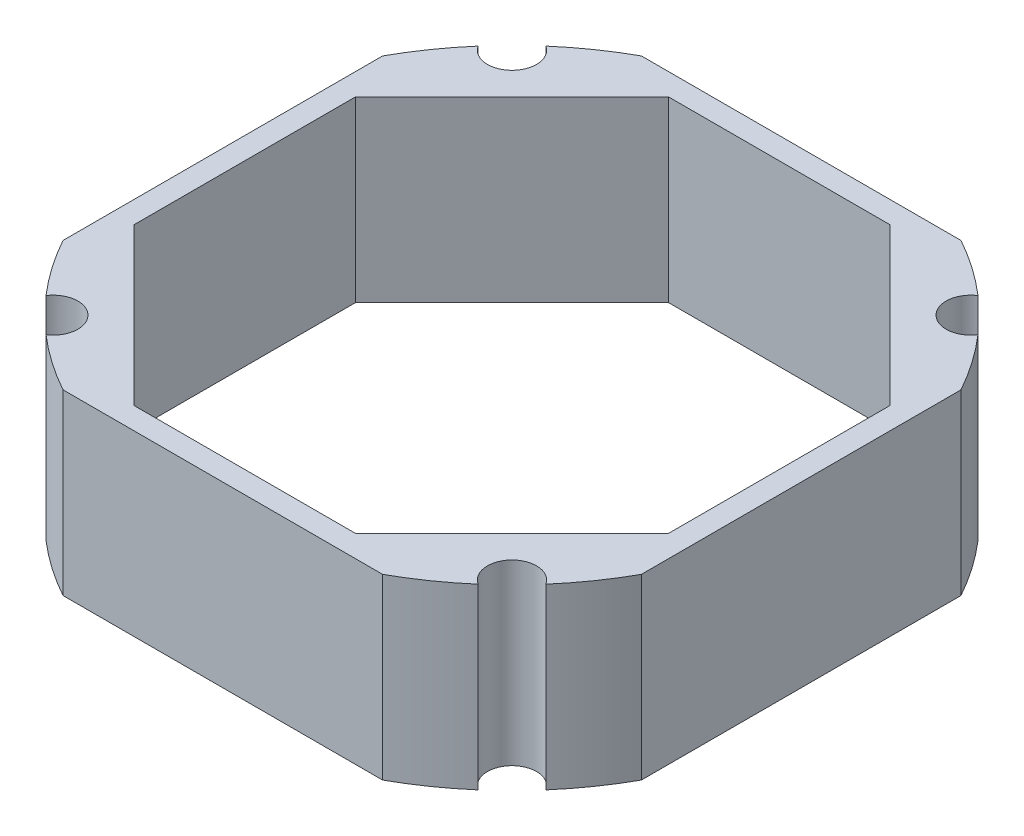
ISO-10303-21;
HEADER;
FILE_DESCRIPTION(('STEP AP214'),'2;1');
FILE_NAME('part.step','',(''),(''),'','','');
FILE_SCHEMA(('AUTOMOTIVE_DESIGN { 1 0 10303 214 1 1 1 1 }'));
ENDSEC;
DATA;
#1=APPLICATION_CONTEXT('core data for automotive mechanical design processes');
#2=APPLICATION_PROTOCOL_DEFINITION('international standard','automotive_design',2000,#1);
#3=PRODUCT_CONTEXT('',#1,'mechanical');
#4=PRODUCT('Part','Part','',(#3));
#5=PRODUCT_RELATED_PRODUCT_CATEGORY('part','',(#4));
#6=PRODUCT_DEFINITION_FORMATION('','',#4);
#7=PRODUCT_DEFINITION_CONTEXT('part definition',#1,'design');
#8=PRODUCT_DEFINITION('design','',#6,#7);
#9=PRODUCT_DEFINITION_SHAPE('','',#8);
#10=(LENGTH_UNIT() NAMED_UNIT(*) SI_UNIT(.MILLI.,.METRE.));
#11=(NAMED_UNIT(*) PLANE_ANGLE_UNIT() SI_UNIT($,.RADIAN.));
#12=(NAMED_UNIT(*) SI_UNIT($,.STERADIAN.) SOLID_ANGLE_UNIT());
#13=UNCERTAINTY_MEASURE_WITH_UNIT(LENGTH_MEASURE(1.E-05),#10,'distance_accuracy_value','');
#14=(GEOMETRIC_REPRESENTATION_CONTEXT(3) GLOBAL_UNCERTAINTY_ASSIGNED_CONTEXT((#13)) GLOBAL_UNIT_ASSIGNED_CONTEXT((#10,
#11,#12)) REPRESENTATION_CONTEXT('',''));
#15=CARTESIAN_POINT('',(0.,0.,0.));
#16=DIRECTION('',(0.,0.,1.));
#17=DIRECTION('',(1.,0.,0.));
#18=AXIS2_PLACEMENT_3D('',#15,#16,#17);
#19=CARTESIAN_POINT('',(-15.4449798680672,12.,15.4449798680672));
#20=DIRECTION('',(0.,-1.,0.));
#21=DIRECTION('',(0.,0.,-1.));
#22=AXIS2_PLACEMENT_3D('',#19,#20,#21);
#23=CYLINDRICAL_SURFACE('',#22,1.65000000000001);
#24=CARTESIAN_POINT('',(-15.4449798680672,0.,15.4449798680672));
#25=DIRECTION('',(0.,1.,0.));
#26=DIRECTION('',(0.,0.,1.));
#27=AXIS2_PLACEMENT_3D('',#24,#25,#26);
#28=CIRCLE('',#27,1.65000000000001);
#29=CARTESIAN_POINT('',(-14.5514142996868,0.,16.8320777647583));
#30=VERTEX_POINT('',#29);
#31=CARTESIAN_POINT('',(-16.8320777647583,0.,14.5514142996868));
#32=VERTEX_POINT('',#31);
#33=EDGE_CURVE('E274',#30,#32,#28,.T.);
#34=ORIENTED_EDGE('',*,*,#33,.F.);
#35=DIRECTION('',(0.,-1.,0.));
#36=VECTOR('',#35,1.);
#37=CARTESIAN_POINT('',(-14.5514142996868,12.,16.8320777647583));
#38=LINE('',#37,#36);
#39=CARTESIAN_POINT('',(-14.5514142996868,12.,16.8320777647583));
#40=VERTEX_POINT('',#39);
#41=EDGE_CURVE('E11',#40,#30,#38,.T.);
#42=ORIENTED_EDGE('',*,*,#41,.F.);
#43=CARTESIAN_POINT('',(-15.4449798680672,12.,15.4449798680672));
#44=DIRECTION('',(0.,1.,0.));
#45=DIRECTION('',(0.,0.,1.));
#46=AXIS2_PLACEMENT_3D('',#43,#44,#45);
#47=CIRCLE('',#46,1.65000000000001);
#48=CARTESIAN_POINT('',(-16.8320777647583,12.,14.5514142996868));
#49=VERTEX_POINT('',#48);
#50=EDGE_CURVE('E442',#40,#49,#47,.T.);
#51=ORIENTED_EDGE('',*,*,#50,.T.);
#52=DIRECTION('',(0.,-1.,0.));
#53=VECTOR('',#52,1.);
#54=CARTESIAN_POINT('',(-16.8320777647583,12.,14.5514142996868));
#55=LINE('',#54,#53);
#56=EDGE_CURVE('E143',#49,#32,#55,.T.);
#57=ORIENTED_EDGE('',*,*,#56,.T.);
#58=EDGE_LOOP('',(#34,#42,#51,#57));
#59=FACE_BOUND('',#58,.T.);
#60=ADVANCED_FACE('F41',(#59),#23,.F.);
#61=CARTESIAN_POINT('',(0.,12.,0.));
#62=DIRECTION('',(0.,-1.,0.));
#63=DIRECTION('',(0.,0.,-1.));
#64=AXIS2_PLACEMENT_3D('',#61,#62,#63);
#65=CYLINDRICAL_SURFACE('',#64,22.25);
#66=CARTESIAN_POINT('',(0.,0.,0.));
#67=DIRECTION('',(0.,1.,0.));
#68=DIRECTION('',(0.,0.,1.));
#69=AXIS2_PLACEMENT_3D('',#66,#67,#68);
#70=CIRCLE('',#69,22.25);
#71=CARTESIAN_POINT('',(-10.7604309857923,0.,19.475));
#72=VERTEX_POINT('',#71);
#73=EDGE_CURVE('E278',#30,#72,#70,.T.);
#74=ORIENTED_EDGE('',*,*,#73,.T.);
#75=DIRECTION('',(0.,-1.,0.));
#76=VECTOR('',#75,1.);
#77=CARTESIAN_POINT('',(-10.7604309857923,12.,19.475));
#78=LINE('',#77,#76);
#79=CARTESIAN_POINT('',(-10.7604309857923,12.,19.475));
#80=VERTEX_POINT('',#79);
#81=EDGE_CURVE('E52',#80,#72,#78,.T.);
#82=ORIENTED_EDGE('',*,*,#81,.F.);
#83=CARTESIAN_POINT('',(0.,12.,0.));
#84=DIRECTION('',(0.,1.,0.));
#85=DIRECTION('',(0.,0.,1.));
#86=AXIS2_PLACEMENT_3D('',#83,#84,#85);
#87=CIRCLE('',#86,22.25);
#88=EDGE_CURVE('E445',#40,#80,#87,.T.);
#89=ORIENTED_EDGE('',*,*,#88,.F.);
#90=ORIENTED_EDGE('',*,*,#41,.T.);
#91=EDGE_LOOP('',(#74,#82,#89,#90));
#92=FACE_BOUND('',#91,.T.);
#93=ADVANCED_FACE('F495',(#92),#65,.T.);
#94=CARTESIAN_POINT('',(0.,12.,19.475));
#95=DIRECTION('',(0.,0.,1.));
#96=DIRECTION('',(1.,0.,0.));
#97=AXIS2_PLACEMENT_3D('',#94,#95,#96);
#98=PLANE('',#97);
#99=DIRECTION('',(-1.,0.,0.));
#100=VECTOR('',#99,1.);
#101=CARTESIAN_POINT('',(0.,0.,19.475));
#102=LINE('',#101,#100);
#103=CARTESIAN_POINT('',(10.7604309857924,0.,19.475));
#104=VERTEX_POINT('',#103);
#105=EDGE_CURVE('E282',#104,#72,#102,.T.);
#106=ORIENTED_EDGE('',*,*,#105,.F.);
#107=DIRECTION('',(0.,-1.,0.));
#108=VECTOR('',#107,1.);
#109=CARTESIAN_POINT('',(10.7604309857924,12.,19.475));
#110=LINE('',#109,#108);
#111=CARTESIAN_POINT('',(10.7604309857924,12.,19.475));
#112=VERTEX_POINT('',#111);
#113=EDGE_CURVE('E372',#112,#104,#110,.T.);
#114=ORIENTED_EDGE('',*,*,#113,.F.);
#115=DIRECTION('',(-1.,0.,0.));
#116=VECTOR('',#115,1.);
#117=CARTESIAN_POINT('',(0.,12.,19.475));
#118=LINE('',#117,#116);
#119=EDGE_CURVE('E448',#112,#80,#118,.T.);
#120=ORIENTED_EDGE('',*,*,#119,.T.);
#121=ORIENTED_EDGE('',*,*,#81,.T.);
#122=EDGE_LOOP('',(#106,#114,#120,#121));
#123=FACE_BOUND('',#122,.T.);
#124=ADVANCED_FACE('F498',(#123),#98,.T.);
#125=CARTESIAN_POINT('',(0.,12.,0.));
#126=DIRECTION('',(0.,-1.,0.));
#127=DIRECTION('',(0.,0.,-1.));
#128=AXIS2_PLACEMENT_3D('',#125,#126,#127);
#129=CYLINDRICAL_SURFACE('',#128,22.25);
#130=CARTESIAN_POINT('',(0.,0.,0.));
#131=DIRECTION('',(0.,1.,0.));
#132=DIRECTION('',(0.,0.,1.));
#133=AXIS2_PLACEMENT_3D('',#130,#131,#132);
#134=CIRCLE('',#133,22.25);
#135=CARTESIAN_POINT('',(14.5514142996868,0.,16.8320777647583));
#136=VERTEX_POINT('',#135);
#137=EDGE_CURVE('E286',#104,#136,#134,.T.);
#138=ORIENTED_EDGE('',*,*,#137,.T.);
#139=DIRECTION('',(0.,-1.,0.));
#140=VECTOR('',#139,1.);
#141=CARTESIAN_POINT('',(14.5514142996868,12.,16.8320777647583));
#142=LINE('',#141,#140);
#143=CARTESIAN_POINT('',(14.5514142996868,12.,16.8320777647583));
#144=VERTEX_POINT('',#143);
#145=EDGE_CURVE('E369',#144,#136,#142,.T.);
#146=ORIENTED_EDGE('',*,*,#145,.F.);
#147=CARTESIAN_POINT('',(0.,12.,0.));
#148=DIRECTION('',(0.,1.,0.));
#149=DIRECTION('',(0.,0.,1.));
#150=AXIS2_PLACEMENT_3D('',#147,#148,#149);
#151=CIRCLE('',#150,22.25);
#152=EDGE_CURVE('E452',#112,#144,#151,.T.);
#153=ORIENTED_EDGE('',*,*,#152,.F.);
#154=ORIENTED_EDGE('',*,*,#113,.T.);
#155=EDGE_LOOP('',(#138,#146,#153,#154));
#156=FACE_BOUND('',#155,.T.);
#157=ADVANCED_FACE('F503',(#156),#129,.T.);
#158=CARTESIAN_POINT('',(15.4449798680672,12.,15.4449798680672));
#159=DIRECTION('',(0.,-1.,0.));
#160=DIRECTION('',(0.,0.,-1.));
#161=AXIS2_PLACEMENT_3D('',#158,#159,#160);
#162=CYLINDRICAL_SURFACE('',#161,1.65);
#163=CARTESIAN_POINT('',(15.4449798680672,0.,15.4449798680672));
#164=DIRECTION('',(0.,1.,0.));
#165=DIRECTION('',(0.,0.,1.));
#166=AXIS2_PLACEMENT_3D('',#163,#164,#165);
#167=CIRCLE('',#166,1.65);
#168=CARTESIAN_POINT('',(16.8320777647583,0.,14.5514142996868));
#169=VERTEX_POINT('',#168);
#170=EDGE_CURVE('E290',#169,#136,#167,.T.);
#171=ORIENTED_EDGE('',*,*,#170,.F.);
#172=DIRECTION('',(0.,-1.,0.));
#173=VECTOR('',#172,1.);
#174=CARTESIAN_POINT('',(16.8320777647583,12.,14.5514142996868));
#175=LINE('',#174,#173);
#176=CARTESIAN_POINT('',(16.8320777647583,12.,14.5514142996868));
#177=VERTEX_POINT('',#176);
#178=EDGE_CURVE('E366',#177,#169,#175,.T.);
#179=ORIENTED_EDGE('',*,*,#178,.F.);
#180=CARTESIAN_POINT('',(15.4449798680672,12.,15.4449798680672));
#181=DIRECTION('',(0.,1.,0.));
#182=DIRECTION('',(0.,0.,1.));
#183=AXIS2_PLACEMENT_3D('',#180,#181,#182);
#184=CIRCLE('',#183,1.65);
#185=EDGE_CURVE('E455',#177,#144,#184,.T.);
#186=ORIENTED_EDGE('',*,*,#185,.T.);
#187=ORIENTED_EDGE('',*,*,#145,.T.);
#188=EDGE_LOOP('',(#171,#179,#186,#187));
#189=FACE_BOUND('',#188,.T.);
#190=ADVANCED_FACE('F509',(#189),#162,.F.);
#191=CARTESIAN_POINT('',(0.,12.,0.));
#192=DIRECTION('',(0.,-1.,0.));
#193=DIRECTION('',(0.,0.,-1.));
#194=AXIS2_PLACEMENT_3D('',#191,#192,#193);
#195=CYLINDRICAL_SURFACE('',#194,22.25);
#196=CARTESIAN_POINT('',(0.,0.,0.));
#197=DIRECTION('',(0.,1.,0.));
#198=DIRECTION('',(0.,0.,1.));
#199=AXIS2_PLACEMENT_3D('',#196,#197,#198);
#200=CIRCLE('',#199,22.25);
#201=CARTESIAN_POINT('',(19.475,0.,10.7604309857923));
#202=VERTEX_POINT('',#201);
#203=EDGE_CURVE('E294',#169,#202,#200,.T.);
#204=ORIENTED_EDGE('',*,*,#203,.T.);
#205=DIRECTION('',(0.,-1.,0.));
#206=VECTOR('',#205,1.);
#207=CARTESIAN_POINT('',(19.475,12.,10.7604309857923));
#208=LINE('',#207,#206);
#209=CARTESIAN_POINT('',(19.475,12.,10.7604309857923));
#210=VERTEX_POINT('',#209);
#211=EDGE_CURVE('E362',#210,#202,#208,.T.);
#212=ORIENTED_EDGE('',*,*,#211,.F.);
#213=CARTESIAN_POINT('',(0.,12.,0.));
#214=DIRECTION('',(0.,1.,0.));
#215=DIRECTION('',(0.,0.,1.));
#216=AXIS2_PLACEMENT_3D('',#213,#214,#215);
#217=CIRCLE('',#216,22.25);
#218=EDGE_CURVE('E459',#177,#210,#217,.T.);
#219=ORIENTED_EDGE('',*,*,#218,.F.);
#220=ORIENTED_EDGE('',*,*,#178,.T.);
#221=EDGE_LOOP('',(#204,#212,#219,#220));
#222=FACE_BOUND('',#221,.T.);
#223=ADVANCED_FACE('F512',(#222),#195,.T.);
#224=CARTESIAN_POINT('',(19.475,12.,0.));
#225=DIRECTION('',(-1.,0.,0.));
#226=DIRECTION('',(0.,0.,1.));
#227=AXIS2_PLACEMENT_3D('',#224,#225,#226);
#228=PLANE('',#227);
#229=DIRECTION('',(0.,0.,-1.));
#230=VECTOR('',#229,1.);
#231=CARTESIAN_POINT('',(19.475,0.,0.));
#232=LINE('',#231,#230);
#233=CARTESIAN_POINT('',(19.475,0.,-10.7604309857923));
#234=VERTEX_POINT('',#233);
#235=EDGE_CURVE('E298',#202,#234,#232,.T.);
#236=ORIENTED_EDGE('',*,*,#235,.T.);
#237=DIRECTION('',(0.,-1.,0.));
#238=VECTOR('',#237,1.);
#239=CARTESIAN_POINT('',(19.475,12.,-10.7604309857923));
#240=LINE('',#239,#238);
#241=CARTESIAN_POINT('',(19.475,12.,-10.7604309857923));
#242=VERTEX_POINT('',#241);
#243=EDGE_CURVE('E358',#242,#234,#240,.T.);
#244=ORIENTED_EDGE('',*,*,#243,.F.);
#245=DIRECTION('',(0.,0.,-1.));
#246=VECTOR('',#245,1.);
#247=CARTESIAN_POINT('',(19.475,12.,0.));
#248=LINE('',#247,#246);
#249=EDGE_CURVE('E463',#210,#242,#248,.T.);
#250=ORIENTED_EDGE('',*,*,#249,.F.);
#251=ORIENTED_EDGE('',*,*,#211,.T.);
#252=EDGE_LOOP('',(#236,#244,#250,#251));
#253=FACE_BOUND('',#252,.T.);
#254=ADVANCED_FACE('F514',(#253),#228,.F.);
#255=CARTESIAN_POINT('',(0.,12.,0.));
#256=DIRECTION('',(0.,-1.,0.));
#257=DIRECTION('',(0.,0.,-1.));
#258=AXIS2_PLACEMENT_3D('',#255,#256,#257);
#259=CYLINDRICAL_SURFACE('',#258,22.25);
#260=CARTESIAN_POINT('',(0.,0.,0.));
#261=DIRECTION('',(0.,1.,0.));
#262=DIRECTION('',(0.,0.,1.));
#263=AXIS2_PLACEMENT_3D('',#260,#261,#262);
#264=CIRCLE('',#263,22.25);
#265=CARTESIAN_POINT('',(16.8320777647583,0.,-14.5514142996868));
#266=VERTEX_POINT('',#265);
#267=EDGE_CURVE('E302',#234,#266,#264,.T.);
#268=ORIENTED_EDGE('',*,*,#267,.T.);
#269=DIRECTION('',(0.,-1.,0.));
#270=VECTOR('',#269,1.);
#271=CARTESIAN_POINT('',(16.8320777647583,12.,-14.5514142996868));
#272=LINE('',#271,#270);
#273=CARTESIAN_POINT('',(16.8320777647583,12.,-14.5514142996868));
#274=VERTEX_POINT('',#273);
#275=EDGE_CURVE('E355',#274,#266,#272,.T.);
#276=ORIENTED_EDGE('',*,*,#275,.F.);
#277=CARTESIAN_POINT('',(0.,12.,0.));
#278=DIRECTION('',(0.,1.,0.));
#279=DIRECTION('',(0.,0.,1.));
#280=AXIS2_PLACEMENT_3D('',#277,#278,#279);
#281=CIRCLE('',#280,22.25);
#282=EDGE_CURVE('E467',#242,#274,#281,.T.);
#283=ORIENTED_EDGE('',*,*,#282,.F.);
#284=ORIENTED_EDGE('',*,*,#243,.T.);
#285=EDGE_LOOP('',(#268,#276,#283,#284));
#286=FACE_BOUND('',#285,.T.);
#287=ADVANCED_FACE('F519',(#286),#259,.T.);
#288=CARTESIAN_POINT('',(15.4449798680672,12.,-15.4449798680672));
#289=DIRECTION('',(0.,-1.,0.));
#290=DIRECTION('',(0.,0.,-1.));
#291=AXIS2_PLACEMENT_3D('',#288,#289,#290);
#292=CYLINDRICAL_SURFACE('',#291,1.64999999999998);
#293=CARTESIAN_POINT('',(15.4449798680672,0.,-15.4449798680672));
#294=DIRECTION('',(0.,1.,0.));
#295=DIRECTION('',(0.,0.,1.));
#296=AXIS2_PLACEMENT_3D('',#293,#294,#295);
#297=CIRCLE('',#296,1.64999999999998);
#298=CARTESIAN_POINT('',(14.5514142996868,0.,-16.8320777647583));
#299=VERTEX_POINT('',#298);
#300=EDGE_CURVE('E306',#299,#266,#297,.T.);
#301=ORIENTED_EDGE('',*,*,#300,.F.);
#302=DIRECTION('',(0.,-1.,0.));
#303=VECTOR('',#302,1.);
#304=CARTESIAN_POINT('',(14.5514142996868,12.,-16.8320777647583));
#305=LINE('',#304,#303);
#306=CARTESIAN_POINT('',(14.5514142996868,12.,-16.8320777647583));
#307=VERTEX_POINT('',#306);
#308=EDGE_CURVE('E352',#307,#299,#305,.T.);
#309=ORIENTED_EDGE('',*,*,#308,.F.);
#310=CARTESIAN_POINT('',(15.4449798680672,12.,-15.4449798680672));
#311=DIRECTION('',(0.,1.,0.));
#312=DIRECTION('',(0.,0.,1.));
#313=AXIS2_PLACEMENT_3D('',#310,#311,#312);
#314=CIRCLE('',#313,1.64999999999998);
#315=EDGE_CURVE('E470',#307,#274,#314,.T.);
#316=ORIENTED_EDGE('',*,*,#315,.T.);
#317=ORIENTED_EDGE('',*,*,#275,.T.);
#318=EDGE_LOOP('',(#301,#309,#316,#317));
#319=FACE_BOUND('',#318,.T.);
#320=ADVANCED_FACE('F522',(#319),#292,.F.);
#321=CARTESIAN_POINT('',(0.,12.,0.));
#322=DIRECTION('',(0.,-1.,0.));
#323=DIRECTION('',(0.,0.,-1.));
#324=AXIS2_PLACEMENT_3D('',#321,#322,#323);
#325=CYLINDRICAL_SURFACE('',#324,22.25);
#326=CARTESIAN_POINT('',(0.,0.,0.));
#327=DIRECTION('',(0.,1.,0.));
#328=DIRECTION('',(0.,0.,1.));
#329=AXIS2_PLACEMENT_3D('',#326,#327,#328);
#330=CIRCLE('',#329,22.25);
#331=CARTESIAN_POINT('',(10.7604309857923,0.,-19.475));
#332=VERTEX_POINT('',#331);
#333=EDGE_CURVE('E310',#299,#332,#330,.T.);
#334=ORIENTED_EDGE('',*,*,#333,.T.);
#335=DIRECTION('',(0.,-1.,0.));
#336=VECTOR('',#335,1.);
#337=CARTESIAN_POINT('',(10.7604309857923,12.,-19.475));
#338=LINE('',#337,#336);
#339=CARTESIAN_POINT('',(10.7604309857923,12.,-19.475));
#340=VERTEX_POINT('',#339);
#341=EDGE_CURVE('E348',#340,#332,#338,.T.);
#342=ORIENTED_EDGE('',*,*,#341,.F.);
#343=CARTESIAN_POINT('',(0.,12.,0.));
#344=DIRECTION('',(0.,1.,0.));
#345=DIRECTION('',(0.,0.,1.));
#346=AXIS2_PLACEMENT_3D('',#343,#344,#345);
#347=CIRCLE('',#346,22.25);
#348=EDGE_CURVE('E474',#307,#340,#347,.T.);
#349=ORIENTED_EDGE('',*,*,#348,.F.);
#350=ORIENTED_EDGE('',*,*,#308,.T.);
#351=EDGE_LOOP('',(#334,#342,#349,#350));
#352=FACE_BOUND('',#351,.T.);
#353=ADVANCED_FACE('F527',(#352),#325,.T.);
#354=CARTESIAN_POINT('',(0.,12.,-19.475));
#355=DIRECTION('',(0.,0.,1.));
#356=DIRECTION('',(1.,0.,0.));
#357=AXIS2_PLACEMENT_3D('',#354,#355,#356);
#358=PLANE('',#357);
#359=DIRECTION('',(-1.,0.,0.));
#360=VECTOR('',#359,1.);
#361=CARTESIAN_POINT('',(0.,0.,-19.475));
#362=LINE('',#361,#360);
#363=CARTESIAN_POINT('',(-10.7604309857923,0.,-19.475));
#364=VERTEX_POINT('',#363);
#365=EDGE_CURVE('E314',#332,#364,#362,.T.);
#366=ORIENTED_EDGE('',*,*,#365,.T.);
#367=DIRECTION('',(0.,-1.,0.));
#368=VECTOR('',#367,1.);
#369=CARTESIAN_POINT('',(-10.7604309857923,12.,-19.475));
#370=LINE('',#369,#368);
#371=CARTESIAN_POINT('',(-10.7604309857923,12.,-19.475));
#372=VERTEX_POINT('',#371);
#373=EDGE_CURVE('E344',#372,#364,#370,.T.);
#374=ORIENTED_EDGE('',*,*,#373,.F.);
#375=DIRECTION('',(-1.,0.,0.));
#376=VECTOR('',#375,1.);
#377=CARTESIAN_POINT('',(0.,12.,-19.475));
#378=LINE('',#377,#376);
#379=EDGE_CURVE('E478',#340,#372,#378,.T.);
#380=ORIENTED_EDGE('',*,*,#379,.F.);
#381=ORIENTED_EDGE('',*,*,#341,.T.);
#382=EDGE_LOOP('',(#366,#374,#380,#381));
#383=FACE_BOUND('',#382,.T.);
#384=ADVANCED_FACE('F530',(#383),#358,.F.);
#385=CARTESIAN_POINT('',(0.,12.,0.));
#386=DIRECTION('',(0.,-1.,0.));
#387=DIRECTION('',(0.,0.,-1.));
#388=AXIS2_PLACEMENT_3D('',#385,#386,#387);
#389=CYLINDRICAL_SURFACE('',#388,22.25);
#390=CARTESIAN_POINT('',(0.,0.,0.));
#391=DIRECTION('',(0.,1.,0.));
#392=DIRECTION('',(0.,0.,1.));
#393=AXIS2_PLACEMENT_3D('',#390,#391,#392);
#394=CIRCLE('',#393,22.25);
#395=CARTESIAN_POINT('',(-14.5514142996868,0.,-16.8320777647583));
#396=VERTEX_POINT('',#395);
#397=EDGE_CURVE('E318',#364,#396,#394,.T.);
#398=ORIENTED_EDGE('',*,*,#397,.T.);
#399=DIRECTION('',(0.,-1.,0.));
#400=VECTOR('',#399,1.);
#401=CARTESIAN_POINT('',(-14.5514142996868,12.,-16.8320777647583));
#402=LINE('',#401,#400);
#403=CARTESIAN_POINT('',(-14.5514142996868,12.,-16.8320777647583));
#404=VERTEX_POINT('',#403);
#405=EDGE_CURVE('E341',#404,#396,#402,.T.);
#406=ORIENTED_EDGE('',*,*,#405,.F.);
#407=CARTESIAN_POINT('',(0.,12.,0.));
#408=DIRECTION('',(0.,1.,0.));
#409=DIRECTION('',(0.,0.,1.));
#410=AXIS2_PLACEMENT_3D('',#407,#408,#409);
#411=CIRCLE('',#410,22.25);
#412=EDGE_CURVE('E482',#372,#404,#411,.T.);
#413=ORIENTED_EDGE('',*,*,#412,.F.);
#414=ORIENTED_EDGE('',*,*,#373,.T.);
#415=EDGE_LOOP('',(#398,#406,#413,#414));
#416=FACE_BOUND('',#415,.T.);
#417=ADVANCED_FACE('F532',(#416),#389,.T.);
#418=CARTESIAN_POINT('',(-15.4449798680672,12.,-15.4449798680672));
#419=DIRECTION('',(0.,-1.,0.));
#420=DIRECTION('',(0.,0.,-1.));
#421=AXIS2_PLACEMENT_3D('',#418,#419,#420);
#422=CYLINDRICAL_SURFACE('',#421,1.65000000000002);
#423=CARTESIAN_POINT('',(-15.4449798680672,0.,-15.4449798680672));
#424=DIRECTION('',(0.,1.,0.));
#425=DIRECTION('',(0.,0.,1.));
#426=AXIS2_PLACEMENT_3D('',#423,#424,#425);
#427=CIRCLE('',#426,1.65000000000002);
#428=CARTESIAN_POINT('',(-16.8320777647583,0.,-14.5514142996868));
#429=VERTEX_POINT('',#428);
#430=EDGE_CURVE('E322',#429,#396,#427,.T.);
#431=ORIENTED_EDGE('',*,*,#430,.F.);
#432=DIRECTION('',(0.,-1.,0.));
#433=VECTOR('',#432,1.);
#434=CARTESIAN_POINT('',(-16.8320777647583,12.,-14.5514142996868));
#435=LINE('',#434,#433);
#436=CARTESIAN_POINT('',(-16.8320777647583,12.,-14.5514142996868));
#437=VERTEX_POINT('',#436);
#438=EDGE_CURVE('E232',#437,#429,#435,.T.);
#439=ORIENTED_EDGE('',*,*,#438,.F.);
#440=CARTESIAN_POINT('',(-15.4449798680672,12.,-15.4449798680672));
#441=DIRECTION('',(0.,1.,0.));
#442=DIRECTION('',(0.,0.,1.));
#443=AXIS2_PLACEMENT_3D('',#440,#441,#442);
#444=CIRCLE('',#443,1.65000000000002);
#445=EDGE_CURVE('E219',#437,#404,#444,.T.);
#446=ORIENTED_EDGE('',*,*,#445,.T.);
#447=ORIENTED_EDGE('',*,*,#405,.T.);
#448=EDGE_LOOP('',(#431,#439,#446,#447));
#449=FACE_BOUND('',#448,.T.);
#450=ADVANCED_FACE('F487',(#449),#422,.F.);
#451=CARTESIAN_POINT('',(0.,12.,0.));
#452=DIRECTION('',(0.,-1.,0.));
#453=DIRECTION('',(0.,0.,-1.));
#454=AXIS2_PLACEMENT_3D('',#451,#452,#453);
#455=CYLINDRICAL_SURFACE('',#454,22.25);
#456=CARTESIAN_POINT('',(0.,0.,0.));
#457=DIRECTION('',(0.,1.,0.));
#458=DIRECTION('',(0.,0.,1.));
#459=AXIS2_PLACEMENT_3D('',#456,#457,#458);
#460=CIRCLE('',#459,22.25);
#461=CARTESIAN_POINT('',(-19.475,0.,-10.7604309857923));
#462=VERTEX_POINT('',#461);
#463=EDGE_CURVE('E227',#429,#462,#460,.T.);
#464=ORIENTED_EDGE('',*,*,#463,.T.);
#465=DIRECTION('',(0.,-1.,0.));
#466=VECTOR('',#465,1.);
#467=CARTESIAN_POINT('',(-19.475,12.,-10.7604309857923));
#468=LINE('',#467,#466);
#469=CARTESIAN_POINT('',(-19.475,12.,-10.7604309857923));
#470=VERTEX_POINT('',#469);
#471=EDGE_CURVE('E224',#470,#462,#468,.T.);
#472=ORIENTED_EDGE('',*,*,#471,.F.);
#473=CARTESIAN_POINT('',(0.,12.,0.));
#474=DIRECTION('',(0.,1.,0.));
#475=DIRECTION('',(0.,0.,1.));
#476=AXIS2_PLACEMENT_3D('',#473,#474,#475);
#477=CIRCLE('',#476,22.25);
#478=EDGE_CURVE('E213',#437,#470,#477,.T.);
#479=ORIENTED_EDGE('',*,*,#478,.F.);
#480=ORIENTED_EDGE('',*,*,#438,.T.);
#481=EDGE_LOOP('',(#464,#472,#479,#480));
#482=FACE_BOUND('',#481,.T.);
#483=ADVANCED_FACE('F225',(#482),#455,.T.);
#484=CARTESIAN_POINT('',(-19.475,12.,0.));
#485=DIRECTION('',(-1.,0.,0.));
#486=DIRECTION('',(0.,0.,1.));
#487=AXIS2_PLACEMENT_3D('',#484,#485,#486);
#488=PLANE('',#487);
#489=DIRECTION('',(0.,0.,-1.));
#490=VECTOR('',#489,1.);
#491=CARTESIAN_POINT('',(-19.475,0.,0.));
#492=LINE('',#491,#490);
#493=CARTESIAN_POINT('',(-19.475,0.,10.7604309857923));
#494=VERTEX_POINT('',#493);
#495=EDGE_CURVE('E328',#494,#462,#492,.T.);
#496=ORIENTED_EDGE('',*,*,#495,.F.);
#497=DIRECTION('',(0.,-1.,0.));
#498=VECTOR('',#497,1.);
#499=CARTESIAN_POINT('',(-19.475,12.,10.7604309857923));
#500=LINE('',#499,#498);
#501=CARTESIAN_POINT('',(-19.475,12.,10.7604309857923));
#502=VERTEX_POINT('',#501);
#503=EDGE_CURVE('E136',#502,#494,#500,.T.);
#504=ORIENTED_EDGE('',*,*,#503,.F.);
#505=DIRECTION('',(0.,0.,-1.));
#506=VECTOR('',#505,1.);
#507=CARTESIAN_POINT('',(-19.475,12.,0.));
#508=LINE('',#507,#506);
#509=EDGE_CURVE('E217',#502,#470,#508,.T.);
#510=ORIENTED_EDGE('',*,*,#509,.T.);
#511=ORIENTED_EDGE('',*,*,#471,.T.);
#512=EDGE_LOOP('',(#496,#504,#510,#511));
#513=FACE_BOUND('',#512,.T.);
#514=ADVANCED_FACE('F234',(#513),#488,.T.);
#515=CARTESIAN_POINT('',(-12.7279220613578,12.,12.7279220613579));
#516=DIRECTION('',(0.707106781186547,0.,-0.707106781186548));
#517=DIRECTION('',(-0.707106781186548,0.,-0.707106781186547));
#518=AXIS2_PLACEMENT_3D('',#515,#516,#517);
#519=PLANE('',#518);
#520=DIRECTION('',(0.707106781186548,0.,0.707106781186547));
#521=VECTOR('',#520,1.);
#522=CARTESIAN_POINT('',(-12.7279220613578,0.,12.7279220613579));
#523=LINE('',#522,#521);
#524=CARTESIAN_POINT('',(-18.,0.,7.45584412271571));
#525=VERTEX_POINT('',#524);
#526=CARTESIAN_POINT('',(-7.45584412271571,0.,18.));
#527=VERTEX_POINT('',#526);
#528=EDGE_CURVE('E242',#525,#527,#523,.T.);
#529=ORIENTED_EDGE('',*,*,#528,.F.);
#530=DIRECTION('',(0.,-1.,0.));
#531=VECTOR('',#530,1.);
#532=CARTESIAN_POINT('',(-18.,12.,7.45584412271571));
#533=LINE('',#532,#531);
#534=CARTESIAN_POINT('',(-18.,12.,7.45584412271571));
#535=VERTEX_POINT('',#534);
#536=EDGE_CURVE('E45',#535,#525,#533,.T.);
#537=ORIENTED_EDGE('',*,*,#536,.F.);
#538=DIRECTION('',(0.707106781186548,0.,0.707106781186547));
#539=VECTOR('',#538,1.);
#540=CARTESIAN_POINT('',(-12.7279220613578,12.,12.7279220613579));
#541=LINE('',#540,#539);
#542=CARTESIAN_POINT('',(-7.45584412271571,12.,18.));
#543=VERTEX_POINT('',#542);
#544=EDGE_CURVE('E334',#535,#543,#541,.T.);
#545=ORIENTED_EDGE('',*,*,#544,.T.);
#546=DIRECTION('',(0.,-1.,0.));
#547=VECTOR('',#546,1.);
#548=CARTESIAN_POINT('',(-7.45584412271571,12.,18.));
#549=LINE('',#548,#547);
#550=EDGE_CURVE('E238',#543,#527,#549,.T.);
#551=ORIENTED_EDGE('',*,*,#550,.T.);
#552=EDGE_LOOP('',(#529,#537,#545,#551));
#553=FACE_BOUND('',#552,.T.);
#554=ADVANCED_FACE('F43',(#553),#519,.T.);
#555=CARTESIAN_POINT('',(-18.,12.,0.));
#556=DIRECTION('',(1.,0.,0.));
#557=DIRECTION('',(0.,0.,-1.));
#558=AXIS2_PLACEMENT_3D('',#555,#556,#557);
#559=PLANE('',#558);
#560=DIRECTION('',(0.,0.,1.));
#561=VECTOR('',#560,1.);
#562=CARTESIAN_POINT('',(-18.,0.,0.));
#563=LINE('',#562,#561);
#564=CARTESIAN_POINT('',(-18.,0.,-7.45584412271571));
#565=VERTEX_POINT('',#564);
#566=EDGE_CURVE('E246',#565,#525,#563,.T.);
#567=ORIENTED_EDGE('',*,*,#566,.F.);
#568=DIRECTION('',(0.,-1.,0.));
#569=VECTOR('',#568,1.);
#570=CARTESIAN_POINT('',(-18.,12.,-7.45584412271571));
#571=LINE('',#570,#569);
#572=CARTESIAN_POINT('',(-18.,12.,-7.45584412271571));
#573=VERTEX_POINT('',#572);
#574=EDGE_CURVE('E393',#573,#565,#571,.T.);
#575=ORIENTED_EDGE('',*,*,#574,.F.);
#576=DIRECTION('',(0.,0.,1.));
#577=VECTOR('',#576,1.);
#578=CARTESIAN_POINT('',(-18.,12.,0.));
#579=LINE('',#578,#577);
#580=EDGE_CURVE('E404',#573,#535,#579,.T.);
#581=ORIENTED_EDGE('',*,*,#580,.T.);
#582=ORIENTED_EDGE('',*,*,#536,.T.);
#583=EDGE_LOOP('',(#567,#575,#581,#582));
#584=FACE_BOUND('',#583,.T.);
#585=ADVANCED_FACE('F402',(#584),#559,.T.);
#586=CARTESIAN_POINT('',(-12.7279220613579,12.,-12.7279220613578));
#587=DIRECTION('',(0.707106781186548,0.,0.707106781186547));
#588=DIRECTION('',(0.707106781186547,0.,-0.707106781186548));
#589=AXIS2_PLACEMENT_3D('',#586,#587,#588);
#590=PLANE('',#589);
#591=DIRECTION('',(-0.707106781186547,0.,0.707106781186548));
#592=VECTOR('',#591,1.);
#593=CARTESIAN_POINT('',(-12.7279220613579,0.,-12.7279220613578));
#594=LINE('',#593,#592);
#595=CARTESIAN_POINT('',(-7.45584412271571,0.,-18.));
#596=VERTEX_POINT('',#595);
#597=EDGE_CURVE('E250',#596,#565,#594,.T.);
#598=ORIENTED_EDGE('',*,*,#597,.F.);
#599=DIRECTION('',(0.,-1.,0.));
#600=VECTOR('',#599,1.);
#601=CARTESIAN_POINT('',(-7.45584412271571,12.,-18.));
#602=LINE('',#601,#600);
#603=CARTESIAN_POINT('',(-7.45584412271571,12.,-18.));
#604=VERTEX_POINT('',#603);
#605=EDGE_CURVE('E391',#604,#596,#602,.T.);
#606=ORIENTED_EDGE('',*,*,#605,.F.);
#607=DIRECTION('',(-0.707106781186547,0.,0.707106781186548));
#608=VECTOR('',#607,1.);
#609=CARTESIAN_POINT('',(-12.7279220613579,12.,-12.7279220613578));
#610=LINE('',#609,#608);
#611=EDGE_CURVE('E412',#604,#573,#610,.T.);
#612=ORIENTED_EDGE('',*,*,#611,.T.);
#613=ORIENTED_EDGE('',*,*,#574,.T.);
#614=EDGE_LOOP('',(#598,#606,#612,#613));
#615=FACE_BOUND('',#614,.T.);
#616=ADVANCED_FACE('F410',(#615),#590,.T.);
#617=CARTESIAN_POINT('',(0.,12.,-18.));
#618=DIRECTION('',(0.,0.,1.));
#619=DIRECTION('',(1.,0.,0.));
#620=AXIS2_PLACEMENT_3D('',#617,#618,#619);
#621=PLANE('',#620);
#622=DIRECTION('',(-1.,0.,0.));
#623=VECTOR('',#622,1.);
#624=CARTESIAN_POINT('',(0.,0.,-18.));
#625=LINE('',#624,#623);
#626=CARTESIAN_POINT('',(7.45584412271571,0.,-18.));
#627=VERTEX_POINT('',#626);
#628=EDGE_CURVE('E254',#627,#596,#625,.T.);
#629=ORIENTED_EDGE('',*,*,#628,.F.);
#630=DIRECTION('',(0.,-1.,0.));
#631=VECTOR('',#630,1.);
#632=CARTESIAN_POINT('',(7.45584412271571,12.,-18.));
#633=LINE('',#632,#631);
#634=CARTESIAN_POINT('',(7.45584412271571,12.,-18.));
#635=VERTEX_POINT('',#634);
#636=EDGE_CURVE('E388',#635,#627,#633,.T.);
#637=ORIENTED_EDGE('',*,*,#636,.F.);
#638=DIRECTION('',(-1.,0.,0.));
#639=VECTOR('',#638,1.);
#640=CARTESIAN_POINT('',(0.,12.,-18.));
#641=LINE('',#640,#639);
#642=EDGE_CURVE('E418',#635,#604,#641,.T.);
#643=ORIENTED_EDGE('',*,*,#642,.T.);
#644=ORIENTED_EDGE('',*,*,#605,.T.);
#645=EDGE_LOOP('',(#629,#637,#643,#644));
#646=FACE_BOUND('',#645,.T.);
#647=ADVANCED_FACE('F422',(#646),#621,.T.);
#648=CARTESIAN_POINT('',(12.7279220613578,12.,-12.7279220613579));
#649=DIRECTION('',(-0.707106781186547,0.,0.707106781186548));
#650=DIRECTION('',(0.707106781186548,0.,0.707106781186547));
#651=AXIS2_PLACEMENT_3D('',#648,#649,#650);
#652=PLANE('',#651);
#653=DIRECTION('',(-0.707106781186548,0.,-0.707106781186547));
#654=VECTOR('',#653,1.);
#655=CARTESIAN_POINT('',(12.7279220613578,0.,-12.7279220613579));
#656=LINE('',#655,#654);
#657=CARTESIAN_POINT('',(18.,0.,-7.45584412271571));
#658=VERTEX_POINT('',#657);
#659=EDGE_CURVE('E258',#658,#627,#656,.T.);
#660=ORIENTED_EDGE('',*,*,#659,.F.);
#661=DIRECTION('',(0.,-1.,0.));
#662=VECTOR('',#661,1.);
#663=CARTESIAN_POINT('',(18.,12.,-7.45584412271571));
#664=LINE('',#663,#662);
#665=CARTESIAN_POINT('',(18.,12.,-7.45584412271571));
#666=VERTEX_POINT('',#665);
#667=EDGE_CURVE('E385',#666,#658,#664,.T.);
#668=ORIENTED_EDGE('',*,*,#667,.F.);
#669=DIRECTION('',(-0.707106781186548,0.,-0.707106781186547));
#670=VECTOR('',#669,1.);
#671=CARTESIAN_POINT('',(12.7279220613578,12.,-12.7279220613579));
#672=LINE('',#671,#670);
#673=EDGE_CURVE('E424',#666,#635,#672,.T.);
#674=ORIENTED_EDGE('',*,*,#673,.T.);
#675=ORIENTED_EDGE('',*,*,#636,.T.);
#676=EDGE_LOOP('',(#660,#668,#674,#675));
#677=FACE_BOUND('',#676,.T.);
#678=ADVANCED_FACE('F560',(#677),#652,.T.);
#679=CARTESIAN_POINT('',(18.,12.,0.));
#680=DIRECTION('',(-1.,0.,0.));
#681=DIRECTION('',(0.,0.,1.));
#682=AXIS2_PLACEMENT_3D('',#679,#680,#681);
#683=PLANE('',#682);
#684=DIRECTION('',(0.,0.,-1.));
#685=VECTOR('',#684,1.);
#686=CARTESIAN_POINT('',(18.,0.,0.));
#687=LINE('',#686,#685);
#688=CARTESIAN_POINT('',(18.,0.,7.45584412271571));
#689=VERTEX_POINT('',#688);
#690=EDGE_CURVE('E262',#689,#658,#687,.T.);
#691=ORIENTED_EDGE('',*,*,#690,.F.);
#692=DIRECTION('',(0.,-1.,0.));
#693=VECTOR('',#692,1.);
#694=CARTESIAN_POINT('',(18.,12.,7.45584412271571));
#695=LINE('',#694,#693);
#696=CARTESIAN_POINT('',(18.,12.,7.45584412271571));
#697=VERTEX_POINT('',#696);
#698=EDGE_CURVE('E382',#697,#689,#695,.T.);
#699=ORIENTED_EDGE('',*,*,#698,.F.);
#700=DIRECTION('',(0.,0.,-1.));
#701=VECTOR('',#700,1.);
#702=CARTESIAN_POINT('',(18.,12.,0.));
#703=LINE('',#702,#701);
#704=EDGE_CURVE('E427',#697,#666,#703,.T.);
#705=ORIENTED_EDGE('',*,*,#704,.T.);
#706=ORIENTED_EDGE('',*,*,#667,.T.);
#707=EDGE_LOOP('',(#691,#699,#705,#706));
#708=FACE_BOUND('',#707,.T.);
#709=ADVANCED_FACE('F556',(#708),#683,.T.);
#710=CARTESIAN_POINT('',(12.7279220613579,12.,12.7279220613579));
#711=DIRECTION('',(-0.707106781186547,0.,-0.707106781186547));
#712=DIRECTION('',(-0.707106781186548,0.,0.707106781186548));
#713=AXIS2_PLACEMENT_3D('',#710,#711,#712);
#714=PLANE('',#713);
#715=DIRECTION('',(0.707106781186548,0.,-0.707106781186548));
#716=VECTOR('',#715,1.);
#717=CARTESIAN_POINT('',(12.7279220613579,0.,12.7279220613579));
#718=LINE('',#717,#716);
#719=CARTESIAN_POINT('',(7.45584412271571,0.,18.));
#720=VERTEX_POINT('',#719);
#721=EDGE_CURVE('E266',#720,#689,#718,.T.);
#722=ORIENTED_EDGE('',*,*,#721,.F.);
#723=DIRECTION('',(0.,-1.,0.));
#724=VECTOR('',#723,1.);
#725=CARTESIAN_POINT('',(7.45584412271571,12.,18.));
#726=LINE('',#725,#724);
#727=CARTESIAN_POINT('',(7.45584412271571,12.,18.));
#728=VERTEX_POINT('',#727);
#729=EDGE_CURVE('E379',#728,#720,#726,.T.);
#730=ORIENTED_EDGE('',*,*,#729,.F.);
#731=DIRECTION('',(0.707106781186548,0.,-0.707106781186548));
#732=VECTOR('',#731,1.);
#733=CARTESIAN_POINT('',(12.7279220613579,12.,12.7279220613579));
#734=LINE('',#733,#732);
#735=EDGE_CURVE('E434',#728,#697,#734,.T.);
#736=ORIENTED_EDGE('',*,*,#735,.T.);
#737=ORIENTED_EDGE('',*,*,#698,.T.);
#738=EDGE_LOOP('',(#722,#730,#736,#737));
#739=FACE_BOUND('',#738,.T.);
#740=ADVANCED_FACE('F552',(#739),#714,.T.);
#741=CARTESIAN_POINT('',(0.,12.,18.));
#742=DIRECTION('',(0.,0.,-1.));
#743=DIRECTION('',(-1.,0.,0.));
#744=AXIS2_PLACEMENT_3D('',#741,#742,#743);
#745=PLANE('',#744);
#746=DIRECTION('',(1.,0.,0.));
#747=VECTOR('',#746,1.);
#748=CARTESIAN_POINT('',(0.,0.,18.));
#749=LINE('',#748,#747);
#750=EDGE_CURVE('E270',#527,#720,#749,.T.);
#751=ORIENTED_EDGE('',*,*,#750,.F.);
#752=ORIENTED_EDGE('',*,*,#550,.F.);
#753=DIRECTION('',(1.,0.,0.));
#754=VECTOR('',#753,1.);
#755=CARTESIAN_POINT('',(0.,12.,18.));
#756=LINE('',#755,#754);
#757=EDGE_CURVE('E438',#543,#728,#756,.T.);
#758=ORIENTED_EDGE('',*,*,#757,.T.);
#759=ORIENTED_EDGE('',*,*,#729,.T.);
#760=EDGE_LOOP('',(#751,#752,#758,#759));
#761=FACE_BOUND('',#760,.T.);
#762=ADVANCED_FACE('F549',(#761),#745,.T.);
#763=CARTESIAN_POINT('',(0.,12.,0.));
#764=DIRECTION('',(0.,-1.,0.));
#765=DIRECTION('',(0.,0.,-1.));
#766=AXIS2_PLACEMENT_3D('',#763,#764,#765);
#767=CYLINDRICAL_SURFACE('',#766,22.25);
#768=CARTESIAN_POINT('',(0.,0.,0.));
#769=DIRECTION('',(0.,1.,0.));
#770=DIRECTION('',(0.,0.,1.));
#771=AXIS2_PLACEMENT_3D('',#768,#769,#770);
#772=CIRCLE('',#771,22.25);
#773=EDGE_CURVE('E331',#494,#32,#772,.T.);
#774=ORIENTED_EDGE('',*,*,#773,.T.);
#775=ORIENTED_EDGE('',*,*,#56,.F.);
#776=CARTESIAN_POINT('',(0.,12.,0.));
#777=DIRECTION('',(0.,1.,0.));
#778=DIRECTION('',(0.,0.,1.));
#779=AXIS2_PLACEMENT_3D('',#776,#777,#778);
#780=CIRCLE('',#779,22.25);
#781=EDGE_CURVE('E61',#502,#49,#780,.T.);
#782=ORIENTED_EDGE('',*,*,#781,.F.);
#783=ORIENTED_EDGE('',*,*,#503,.T.);
#784=EDGE_LOOP('',(#774,#775,#782,#783));
#785=FACE_BOUND('',#784,.T.);
#786=ADVANCED_FACE('F490',(#785),#767,.T.);
#787=CARTESIAN_POINT('',(0.,12.,0.));
#788=DIRECTION('',(0.,1.,0.));
#789=DIRECTION('',(0.,0.,1.));
#790=AXIS2_PLACEMENT_3D('',#787,#788,#789);
#791=PLANE('',#790);
#792=ORIENTED_EDGE('',*,*,#544,.F.);
#793=ORIENTED_EDGE('',*,*,#580,.F.);
#794=ORIENTED_EDGE('',*,*,#611,.F.);
#795=ORIENTED_EDGE('',*,*,#642,.F.);
#796=ORIENTED_EDGE('',*,*,#673,.F.);
#797=ORIENTED_EDGE('',*,*,#704,.F.);
#798=ORIENTED_EDGE('',*,*,#735,.F.);
#799=ORIENTED_EDGE('',*,*,#757,.F.);
#800=EDGE_LOOP('',(#792,#793,#794,#795,#796,#797,#798,#799));
#801=FACE_BOUND('',#800,.T.);
#802=ORIENTED_EDGE('',*,*,#50,.F.);
#803=ORIENTED_EDGE('',*,*,#88,.T.);
#804=ORIENTED_EDGE('',*,*,#119,.F.);
#805=ORIENTED_EDGE('',*,*,#152,.T.);
#806=ORIENTED_EDGE('',*,*,#185,.F.);
#807=ORIENTED_EDGE('',*,*,#218,.T.);
#808=ORIENTED_EDGE('',*,*,#249,.T.);
#809=ORIENTED_EDGE('',*,*,#282,.T.);
#810=ORIENTED_EDGE('',*,*,#315,.F.);
#811=ORIENTED_EDGE('',*,*,#348,.T.);
#812=ORIENTED_EDGE('',*,*,#379,.T.);
#813=ORIENTED_EDGE('',*,*,#412,.T.);
#814=ORIENTED_EDGE('',*,*,#445,.F.);
#815=ORIENTED_EDGE('',*,*,#478,.T.);
#816=ORIENTED_EDGE('',*,*,#509,.F.);
#817=ORIENTED_EDGE('',*,*,#781,.T.);
#818=EDGE_LOOP('',(#802,#803,#804,#805,#806,#807,#808,#809,#810,#811,#812,#813,#814,#815,#816,#817));
#819=FACE_BOUND('',#818,.T.);
#820=ADVANCED_FACE('F215',(#801,#819),#791,.T.);
#821=CARTESIAN_POINT('',(0.,0.,0.));
#822=DIRECTION('',(0.,1.,0.));
#823=DIRECTION('',(0.,0.,1.));
#824=AXIS2_PLACEMENT_3D('',#821,#822,#823);
#825=PLANE('',#824);
#826=ORIENTED_EDGE('',*,*,#528,.T.);
#827=ORIENTED_EDGE('',*,*,#750,.T.);
#828=ORIENTED_EDGE('',*,*,#721,.T.);
#829=ORIENTED_EDGE('',*,*,#690,.T.);
#830=ORIENTED_EDGE('',*,*,#659,.T.);
#831=ORIENTED_EDGE('',*,*,#628,.T.);
#832=ORIENTED_EDGE('',*,*,#597,.T.);
#833=ORIENTED_EDGE('',*,*,#566,.T.);
#834=EDGE_LOOP('',(#826,#827,#828,#829,#830,#831,#832,#833));
#835=FACE_BOUND('',#834,.T.);
#836=ORIENTED_EDGE('',*,*,#33,.T.);
#837=ORIENTED_EDGE('',*,*,#773,.F.);
#838=ORIENTED_EDGE('',*,*,#495,.T.);
#839=ORIENTED_EDGE('',*,*,#463,.F.);
#840=ORIENTED_EDGE('',*,*,#430,.T.);
#841=ORIENTED_EDGE('',*,*,#397,.F.);
#842=ORIENTED_EDGE('',*,*,#365,.F.);
#843=ORIENTED_EDGE('',*,*,#333,.F.);
#844=ORIENTED_EDGE('',*,*,#300,.T.);
#845=ORIENTED_EDGE('',*,*,#267,.F.);
#846=ORIENTED_EDGE('',*,*,#235,.F.);
#847=ORIENTED_EDGE('',*,*,#203,.F.);
#848=ORIENTED_EDGE('',*,*,#170,.T.);
#849=ORIENTED_EDGE('',*,*,#137,.F.);
#850=ORIENTED_EDGE('',*,*,#105,.T.);
#851=ORIENTED_EDGE('',*,*,#73,.F.);
#852=EDGE_LOOP('',(#836,#837,#838,#839,#840,#841,#842,#843,#844,#845,#846,#847,#848,#849,#850,#851));
#853=FACE_BOUND('',#852,.T.);
#854=ADVANCED_FACE('F407',(#835,#853),#825,.F.);
#855=CLOSED_SHELL('',(#60,#93,#124,#157,#190,#223,#254,#287,#320,#353,#384,#417,#450,#483,#514,
#554,#585,#616,#647,#678,#709,#740,#762,#786,#820,#854));
#856=MANIFOLD_SOLID_BREP('B2',#855);
#857=ADVANCED_BREP_SHAPE_REPRESENTATION('',(#18,#856),#14);
#858=SHAPE_DEFINITION_REPRESENTATION(#9,#857);
ENDSEC;
END-ISO-10303-21;
